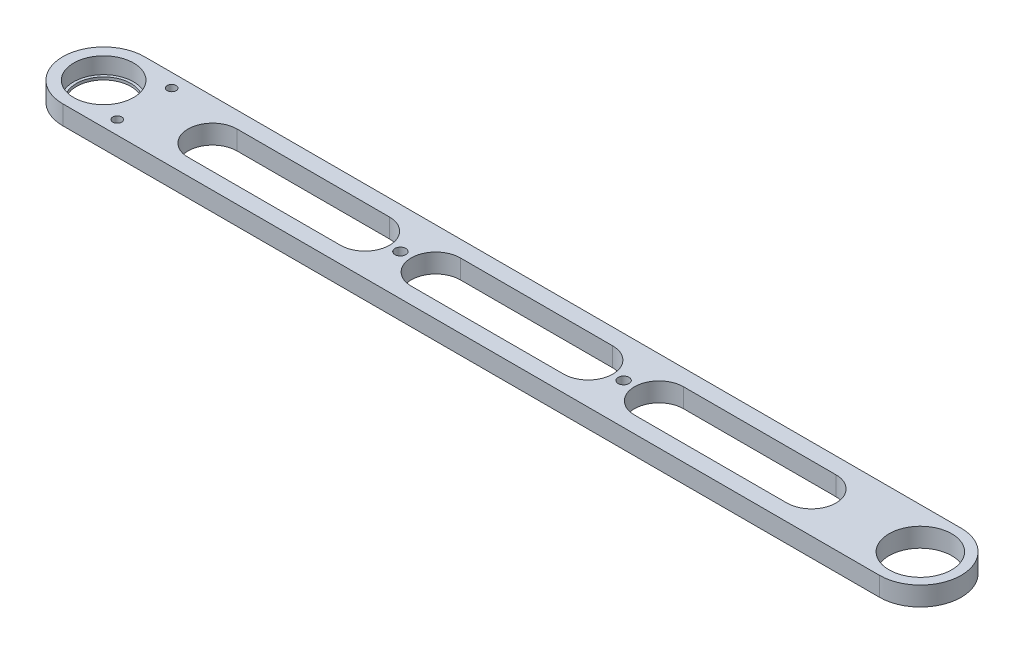
ISO-10303-21;
HEADER;
FILE_DESCRIPTION(('STEP AP214'),'2;1');
FILE_NAME('part.step','',(''),(''),'','','');
FILE_SCHEMA(('AUTOMOTIVE_DESIGN { 1 0 10303 214 1 1 1 1 }'));
ENDSEC;
DATA;
#1=APPLICATION_CONTEXT('core data for automotive mechanical design processes');
#2=APPLICATION_PROTOCOL_DEFINITION('international standard','automotive_design',2000,#1);
#3=PRODUCT_CONTEXT('',#1,'mechanical');
#4=PRODUCT('Part','Part','',(#3));
#5=PRODUCT_RELATED_PRODUCT_CATEGORY('part','',(#4));
#6=PRODUCT_DEFINITION_FORMATION('','',#4);
#7=PRODUCT_DEFINITION_CONTEXT('part definition',#1,'design');
#8=PRODUCT_DEFINITION('design','',#6,#7);
#9=PRODUCT_DEFINITION_SHAPE('','',#8);
#10=(LENGTH_UNIT() NAMED_UNIT(*) SI_UNIT(.MILLI.,.METRE.));
#11=(NAMED_UNIT(*) PLANE_ANGLE_UNIT() SI_UNIT($,.RADIAN.));
#12=(NAMED_UNIT(*) SI_UNIT($,.STERADIAN.) SOLID_ANGLE_UNIT());
#13=UNCERTAINTY_MEASURE_WITH_UNIT(LENGTH_MEASURE(1.E-05),#10,'distance_accuracy_value','');
#14=(GEOMETRIC_REPRESENTATION_CONTEXT(3) GLOBAL_UNCERTAINTY_ASSIGNED_CONTEXT((#13)) GLOBAL_UNIT_ASSIGNED_CONTEXT((#10,
#11,#12)) REPRESENTATION_CONTEXT('',''));
#15=CARTESIAN_POINT('',(0.,0.,0.));
#16=DIRECTION('',(0.,0.,1.));
#17=DIRECTION('',(1.,0.,0.));
#18=AXIS2_PLACEMENT_3D('',#15,#16,#17);
#19=CARTESIAN_POINT('',(-150.,7.,0.));
#20=DIRECTION('',(0.,-1.,0.));
#21=DIRECTION('',(0.,0.,-1.));
#22=AXIS2_PLACEMENT_3D('',#19,#20,#21);
#23=CYLINDRICAL_SURFACE('',#22,10.);
#24=CARTESIAN_POINT('',(-150.,0.,0.));
#25=DIRECTION('',(0.,1.,0.));
#26=DIRECTION('',(0.,0.,1.));
#27=AXIS2_PLACEMENT_3D('',#24,#25,#26);
#28=CIRCLE('',#27,10.);
#29=CARTESIAN_POINT('',(-150.,0.,10.));
#30=VERTEX_POINT('',#29);
#31=EDGE_CURVE('E284',#30,#30,#28,.T.);
#32=ORIENTED_EDGE('',*,*,#31,.F.);
#33=EDGE_LOOP('',(#32));
#34=FACE_BOUND('',#33,.T.);
#35=CARTESIAN_POINT('',(-150.,1.,0.));
#36=DIRECTION('',(0.,1.,0.));
#37=DIRECTION('',(0.,0.,1.));
#38=AXIS2_PLACEMENT_3D('',#35,#36,#37);
#39=CIRCLE('',#38,10.);
#40=CARTESIAN_POINT('',(-150.,1.,10.));
#41=VERTEX_POINT('',#40);
#42=EDGE_CURVE('E42',#41,#41,#39,.T.);
#43=ORIENTED_EDGE('',*,*,#42,.T.);
#44=EDGE_LOOP('',(#43));
#45=FACE_BOUND('',#44,.T.);
#46=ADVANCED_FACE('F38',(#34,#45),#23,.F.);
#47=CARTESIAN_POINT('',(150.,7.,0.));
#48=DIRECTION('',(0.,1.,0.));
#49=DIRECTION('',(0.,0.,1.));
#50=AXIS2_PLACEMENT_3D('',#47,#48,#49);
#51=PLANE('',#50);
#52=CARTESIAN_POINT('',(-135.,7.,-10.));
#53=DIRECTION('',(0.,1.,0.));
#54=DIRECTION('',(0.,0.,1.));
#55=AXIS2_PLACEMENT_3D('',#52,#53,#54);
#56=CIRCLE('',#55,1.64999999999998);
#57=CARTESIAN_POINT('',(-135.,7.,-8.35000000000005));
#58=VERTEX_POINT('',#57);
#59=EDGE_CURVE('E169',#58,#58,#56,.T.);
#60=ORIENTED_EDGE('',*,*,#59,.F.);
#61=EDGE_LOOP('',(#60));
#62=FACE_BOUND('',#61,.T.);
#63=CARTESIAN_POINT('',(-135.,7.,10.));
#64=DIRECTION('',(0.,1.,0.));
#65=DIRECTION('',(0.,0.,1.));
#66=AXIS2_PLACEMENT_3D('',#63,#64,#65);
#67=CIRCLE('',#66,1.64999999999998);
#68=CARTESIAN_POINT('',(-135.,7.,11.65));
#69=VERTEX_POINT('',#68);
#70=EDGE_CURVE('E168',#69,#69,#67,.T.);
#71=ORIENTED_EDGE('',*,*,#70,.F.);
#72=EDGE_LOOP('',(#71));
#73=FACE_BOUND('',#72,.T.);
#74=CARTESIAN_POINT('',(-150.,7.,0.));
#75=DIRECTION('',(0.,1.,0.));
#76=DIRECTION('',(0.,0.,1.));
#77=AXIS2_PLACEMENT_3D('',#74,#75,#76);
#78=CIRCLE('',#77,11.);
#79=CARTESIAN_POINT('',(-150.,7.,11.));
#80=VERTEX_POINT('',#79);
#81=EDGE_CURVE('E179',#80,#80,#78,.T.);
#82=ORIENTED_EDGE('',*,*,#81,.F.);
#83=EDGE_LOOP('',(#82));
#84=FACE_BOUND('',#83,.T.);
#85=CARTESIAN_POINT('',(40.9999999073436,7.,0.));
#86=DIRECTION('',(0.,1.,0.));
#87=DIRECTION('',(0.,0.,1.));
#88=AXIS2_PLACEMENT_3D('',#85,#86,#87);
#89=CIRCLE('',#88,2.);
#90=CARTESIAN_POINT('',(40.9999999073436,7.,2.));
#91=VERTEX_POINT('',#90);
#92=EDGE_CURVE('E192',#91,#91,#89,.T.);
#93=ORIENTED_EDGE('',*,*,#92,.F.);
#94=EDGE_LOOP('',(#93));
#95=FACE_BOUND('',#94,.T.);
#96=CARTESIAN_POINT('',(150.,7.,0.));
#97=DIRECTION('',(0.,1.,0.));
#98=DIRECTION('',(0.,0.,1.));
#99=AXIS2_PLACEMENT_3D('',#96,#97,#98);
#100=CIRCLE('',#99,11.5);
#101=CARTESIAN_POINT('',(150.,7.,11.5));
#102=VERTEX_POINT('',#101);
#103=EDGE_CURVE('E288',#102,#102,#100,.T.);
#104=ORIENTED_EDGE('',*,*,#103,.F.);
#105=EDGE_LOOP('',(#104));
#106=FACE_BOUND('',#105,.T.);
#107=CARTESIAN_POINT('',(150.,7.,0.));
#108=DIRECTION('',(0.,1.,0.));
#109=DIRECTION('',(0.,0.,1.));
#110=AXIS2_PLACEMENT_3D('',#107,#108,#109);
#111=CIRCLE('',#110,15.);
#112=CARTESIAN_POINT('',(150.,7.,15.));
#113=VERTEX_POINT('',#112);
#114=CARTESIAN_POINT('',(150.,7.,-15.0000000000001));
#115=VERTEX_POINT('',#114);
#116=EDGE_CURVE('E294',#113,#115,#111,.T.);
#117=ORIENTED_EDGE('',*,*,#116,.T.);
#118=DIRECTION('',(-1.,0.,0.));
#119=VECTOR('',#118,1.);
#120=CARTESIAN_POINT('',(-150.,7.,-15.));
#121=LINE('',#120,#119);
#122=CARTESIAN_POINT('',(-150.,7.,-15.));
#123=VERTEX_POINT('',#122);
#124=EDGE_CURVE('E297',#115,#123,#121,.T.);
#125=ORIENTED_EDGE('',*,*,#124,.T.);
#126=CARTESIAN_POINT('',(-150.,7.,0.));
#127=DIRECTION('',(0.,1.,0.));
#128=DIRECTION('',(0.,0.,1.));
#129=AXIS2_PLACEMENT_3D('',#126,#127,#128);
#130=CIRCLE('',#129,15.);
#131=CARTESIAN_POINT('',(-150.,7.,15.));
#132=VERTEX_POINT('',#131);
#133=EDGE_CURVE('E300',#123,#132,#130,.T.);
#134=ORIENTED_EDGE('',*,*,#133,.T.);
#135=DIRECTION('',(1.,0.,0.));
#136=VECTOR('',#135,1.);
#137=CARTESIAN_POINT('',(150.,7.,15.));
#138=LINE('',#137,#136);
#139=EDGE_CURVE('E302',#132,#113,#138,.T.);
#140=ORIENTED_EDGE('',*,*,#139,.T.);
#141=EDGE_LOOP('',(#117,#125,#134,#140));
#142=FACE_BOUND('',#141,.T.);
#143=DIRECTION('',(1.,0.,0.));
#144=VECTOR('',#143,1.);
#145=CARTESIAN_POINT('',(-110.,7.,9.));
#146=LINE('',#145,#144);
#147=CARTESIAN_POINT('',(-110.,7.,9.));
#148=VERTEX_POINT('',#147);
#149=CARTESIAN_POINT('',(-53.9999999803265,7.,9.));
#150=VERTEX_POINT('',#149);
#151=EDGE_CURVE('E256',#148,#150,#146,.T.);
#152=ORIENTED_EDGE('',*,*,#151,.F.);
#153=CARTESIAN_POINT('',(-110.,7.,0.));
#154=DIRECTION('',(0.,1.,0.));
#155=DIRECTION('',(0.,0.,-1.));
#156=AXIS2_PLACEMENT_3D('',#153,#154,#155);
#157=CIRCLE('',#156,9.);
#158=CARTESIAN_POINT('',(-110.,7.,-9.));
#159=VERTEX_POINT('',#158);
#160=EDGE_CURVE('E254',#159,#148,#157,.T.);
#161=ORIENTED_EDGE('',*,*,#160,.F.);
#162=DIRECTION('',(-1.,0.,0.));
#163=VECTOR('',#162,1.);
#164=CARTESIAN_POINT('',(-53.9999999803265,7.,-9.));
#165=LINE('',#164,#163);
#166=CARTESIAN_POINT('',(-53.9999999803265,7.,-9.));
#167=VERTEX_POINT('',#166);
#168=EDGE_CURVE('E262',#167,#159,#165,.T.);
#169=ORIENTED_EDGE('',*,*,#168,.F.);
#170=CARTESIAN_POINT('',(-53.9999999803265,7.,0.));
#171=DIRECTION('',(0.,1.,0.));
#172=DIRECTION('',(0.,0.,1.));
#173=AXIS2_PLACEMENT_3D('',#170,#171,#172);
#174=CIRCLE('',#173,9.);
#175=EDGE_CURVE('E259',#150,#167,#174,.T.);
#176=ORIENTED_EDGE('',*,*,#175,.F.);
#177=EDGE_LOOP('',(#152,#161,#169,#176));
#178=FACE_BOUND('',#177,.T.);
#179=DIRECTION('',(1.,0.,0.));
#180=VECTOR('',#179,1.);
#181=CARTESIAN_POINT('',(-28.00000011233,7.,9.));
#182=LINE('',#181,#180);
#183=CARTESIAN_POINT('',(-28.00000011233,7.,9.));
#184=VERTEX_POINT('',#183);
#185=CARTESIAN_POINT('',(27.9999999073436,7.,9.));
#186=VERTEX_POINT('',#185);
#187=EDGE_CURVE('E225',#184,#186,#182,.T.);
#188=ORIENTED_EDGE('',*,*,#187,.F.);
#189=CARTESIAN_POINT('',(-27.9999999803265,7.,0.));
#190=DIRECTION('',(0.,1.,0.));
#191=DIRECTION('',(0.,0.,-1.));
#192=AXIS2_PLACEMENT_3D('',#189,#190,#191);
#193=CIRCLE('',#192,9.);
#194=CARTESIAN_POINT('',(-28.00000011233,7.,-9.));
#195=VERTEX_POINT('',#194);
#196=EDGE_CURVE('E223',#195,#184,#193,.T.);
#197=ORIENTED_EDGE('',*,*,#196,.F.);
#198=DIRECTION('',(-1.,0.,0.));
#199=VECTOR('',#198,1.);
#200=CARTESIAN_POINT('',(27.9999999073436,7.,-9.));
#201=LINE('',#200,#199);
#202=CARTESIAN_POINT('',(27.9999999073436,7.,-9.));
#203=VERTEX_POINT('',#202);
#204=EDGE_CURVE('E231',#203,#195,#201,.T.);
#205=ORIENTED_EDGE('',*,*,#204,.F.);
#206=CARTESIAN_POINT('',(27.9999999073436,7.,0.));
#207=DIRECTION('',(0.,1.,0.));
#208=DIRECTION('',(0.,0.,1.));
#209=AXIS2_PLACEMENT_3D('',#206,#207,#208);
#210=CIRCLE('',#209,9.);
#211=EDGE_CURVE('E228',#186,#203,#210,.T.);
#212=ORIENTED_EDGE('',*,*,#211,.F.);
#213=EDGE_LOOP('',(#188,#197,#205,#212));
#214=FACE_BOUND('',#213,.T.);
#215=DIRECTION('',(1.,0.,0.));
#216=VECTOR('',#215,1.);
#217=CARTESIAN_POINT('',(53.9999999073436,7.,9.));
#218=LINE('',#217,#216);
#219=CARTESIAN_POINT('',(53.9999999073436,7.,9.));
#220=VERTEX_POINT('',#219);
#221=CARTESIAN_POINT('',(109.999999927017,7.,9.));
#222=VERTEX_POINT('',#221);
#223=EDGE_CURVE('E199',#220,#222,#218,.T.);
#224=ORIENTED_EDGE('',*,*,#223,.F.);
#225=CARTESIAN_POINT('',(53.9999999073436,7.,0.));
#226=DIRECTION('',(0.,1.,0.));
#227=DIRECTION('',(0.,0.,-1.));
#228=AXIS2_PLACEMENT_3D('',#225,#226,#227);
#229=CIRCLE('',#228,9.);
#230=CARTESIAN_POINT('',(53.9999999073436,7.,-9.));
#231=VERTEX_POINT('',#230);
#232=EDGE_CURVE('E197',#231,#220,#229,.T.);
#233=ORIENTED_EDGE('',*,*,#232,.F.);
#234=DIRECTION('',(-1.,0.,0.));
#235=VECTOR('',#234,1.);
#236=CARTESIAN_POINT('',(109.999999927017,7.,-9.));
#237=LINE('',#236,#235);
#238=CARTESIAN_POINT('',(109.999999927017,7.,-9.));
#239=VERTEX_POINT('',#238);
#240=EDGE_CURVE('E204',#239,#231,#237,.T.);
#241=ORIENTED_EDGE('',*,*,#240,.F.);
#242=CARTESIAN_POINT('',(110.,7.,0.));
#243=DIRECTION('',(0.,1.,0.));
#244=DIRECTION('',(0.,0.,1.));
#245=AXIS2_PLACEMENT_3D('',#242,#243,#244);
#246=CIRCLE('',#245,9.);
#247=EDGE_CURVE('E202',#222,#239,#246,.T.);
#248=ORIENTED_EDGE('',*,*,#247,.F.);
#249=EDGE_LOOP('',(#224,#233,#241,#248));
#250=FACE_BOUND('',#249,.T.);
#251=CARTESIAN_POINT('',(-40.9999999803265,7.,0.));
#252=DIRECTION('',(0.,1.,0.));
#253=DIRECTION('',(0.,0.,1.));
#254=AXIS2_PLACEMENT_3D('',#251,#252,#253);
#255=CIRCLE('',#254,2.);
#256=CARTESIAN_POINT('',(-40.9999999803265,7.,2.));
#257=VERTEX_POINT('',#256);
#258=EDGE_CURVE('E185',#257,#257,#255,.T.);
#259=ORIENTED_EDGE('',*,*,#258,.F.);
#260=EDGE_LOOP('',(#259));
#261=FACE_BOUND('',#260,.T.);
#262=ADVANCED_FACE('F338',(#62,#73,#84,#95,#106,#142,#178,#214,#250,#261),#51,.T.);
#263=CARTESIAN_POINT('',(150.,0.,0.));
#264=DIRECTION('',(0.,1.,0.));
#265=DIRECTION('',(0.,0.,1.));
#266=AXIS2_PLACEMENT_3D('',#263,#264,#265);
#267=PLANE('',#266);
#268=CARTESIAN_POINT('',(-27.9999999803265,0.,0.));
#269=DIRECTION('',(0.,1.,0.));
#270=DIRECTION('',(0.,0.,-1.));
#271=AXIS2_PLACEMENT_3D('',#268,#269,#270);
#272=CIRCLE('',#271,9.);
#273=CARTESIAN_POINT('',(-28.0000001123299,0.,-9.));
#274=VERTEX_POINT('',#273);
#275=CARTESIAN_POINT('',(-28.00000011233,0.,9.));
#276=VERTEX_POINT('',#275);
#277=EDGE_CURVE('E222',#274,#276,#272,.T.);
#278=ORIENTED_EDGE('',*,*,#277,.T.);
#279=DIRECTION('',(1.,0.,0.));
#280=VECTOR('',#279,1.);
#281=CARTESIAN_POINT('',(-28.00000011233,0.,9.));
#282=LINE('',#281,#280);
#283=CARTESIAN_POINT('',(27.9999999073436,0.,9.));
#284=VERTEX_POINT('',#283);
#285=EDGE_CURVE('E236',#276,#284,#282,.T.);
#286=ORIENTED_EDGE('',*,*,#285,.T.);
#287=CARTESIAN_POINT('',(27.9999999073436,0.,0.));
#288=DIRECTION('',(0.,1.,0.));
#289=DIRECTION('',(0.,0.,1.));
#290=AXIS2_PLACEMENT_3D('',#287,#288,#289);
#291=CIRCLE('',#290,9.);
#292=CARTESIAN_POINT('',(27.9999999073436,0.,-9.));
#293=VERTEX_POINT('',#292);
#294=EDGE_CURVE('E239',#284,#293,#291,.T.);
#295=ORIENTED_EDGE('',*,*,#294,.T.);
#296=DIRECTION('',(-1.,0.,0.));
#297=VECTOR('',#296,1.);
#298=CARTESIAN_POINT('',(27.9999999073436,0.,-9.));
#299=LINE('',#298,#297);
#300=EDGE_CURVE('E226',#293,#274,#299,.T.);
#301=ORIENTED_EDGE('',*,*,#300,.T.);
#302=EDGE_LOOP('',(#278,#286,#295,#301));
#303=FACE_BOUND('',#302,.T.);
#304=ORIENTED_EDGE('',*,*,#31,.T.);
#305=EDGE_LOOP('',(#304));
#306=FACE_BOUND('',#305,.T.);
#307=CARTESIAN_POINT('',(150.,0.,0.));
#308=DIRECTION('',(0.,1.,0.));
#309=DIRECTION('',(0.,0.,1.));
#310=AXIS2_PLACEMENT_3D('',#307,#308,#309);
#311=CIRCLE('',#310,11.5);
#312=CARTESIAN_POINT('',(150.,0.,11.5));
#313=VERTEX_POINT('',#312);
#314=EDGE_CURVE('E287',#313,#313,#311,.T.);
#315=ORIENTED_EDGE('',*,*,#314,.T.);
#316=EDGE_LOOP('',(#315));
#317=FACE_BOUND('',#316,.T.);
#318=CARTESIAN_POINT('',(150.,0.,0.));
#319=DIRECTION('',(0.,1.,0.));
#320=DIRECTION('',(0.,0.,1.));
#321=AXIS2_PLACEMENT_3D('',#318,#319,#320);
#322=CIRCLE('',#321,15.);
#323=CARTESIAN_POINT('',(150.,0.,15.));
#324=VERTEX_POINT('',#323);
#325=CARTESIAN_POINT('',(150.,0.,-15.0000000000001));
#326=VERTEX_POINT('',#325);
#327=EDGE_CURVE('E291',#324,#326,#322,.T.);
#328=ORIENTED_EDGE('',*,*,#327,.F.);
#329=DIRECTION('',(1.,0.,0.));
#330=VECTOR('',#329,1.);
#331=CARTESIAN_POINT('',(150.,0.,15.));
#332=LINE('',#331,#330);
#333=CARTESIAN_POINT('',(-150.,0.,15.));
#334=VERTEX_POINT('',#333);
#335=EDGE_CURVE('E298',#334,#324,#332,.T.);
#336=ORIENTED_EDGE('',*,*,#335,.F.);
#337=CARTESIAN_POINT('',(-150.,0.,0.));
#338=DIRECTION('',(0.,1.,0.));
#339=DIRECTION('',(0.,0.,1.));
#340=AXIS2_PLACEMENT_3D('',#337,#338,#339);
#341=CIRCLE('',#340,15.);
#342=CARTESIAN_POINT('',(-150.,0.,-15.));
#343=VERTEX_POINT('',#342);
#344=EDGE_CURVE('E309',#343,#334,#341,.T.);
#345=ORIENTED_EDGE('',*,*,#344,.F.);
#346=DIRECTION('',(-1.,0.,0.));
#347=VECTOR('',#346,1.);
#348=CARTESIAN_POINT('',(-150.,0.,-15.));
#349=LINE('',#348,#347);
#350=EDGE_CURVE('E307',#326,#343,#349,.T.);
#351=ORIENTED_EDGE('',*,*,#350,.F.);
#352=EDGE_LOOP('',(#328,#336,#345,#351));
#353=FACE_BOUND('',#352,.T.);
#354=CARTESIAN_POINT('',(-110.,0.,0.));
#355=DIRECTION('',(0.,1.,0.));
#356=DIRECTION('',(0.,0.,-1.));
#357=AXIS2_PLACEMENT_3D('',#354,#355,#356);
#358=CIRCLE('',#357,9.);
#359=CARTESIAN_POINT('',(-110.,0.,-9.));
#360=VERTEX_POINT('',#359);
#361=CARTESIAN_POINT('',(-110.,0.,9.));
#362=VERTEX_POINT('',#361);
#363=EDGE_CURVE('E253',#360,#362,#358,.T.);
#364=ORIENTED_EDGE('',*,*,#363,.T.);
#365=DIRECTION('',(1.,0.,0.));
#366=VECTOR('',#365,1.);
#367=CARTESIAN_POINT('',(-110.,0.,9.));
#368=LINE('',#367,#366);
#369=CARTESIAN_POINT('',(-53.9999999803265,0.,9.));
#370=VERTEX_POINT('',#369);
#371=EDGE_CURVE('E267',#362,#370,#368,.T.);
#372=ORIENTED_EDGE('',*,*,#371,.T.);
#373=CARTESIAN_POINT('',(-53.9999999803265,0.,0.));
#374=DIRECTION('',(0.,1.,0.));
#375=DIRECTION('',(0.,0.,1.));
#376=AXIS2_PLACEMENT_3D('',#373,#374,#375);
#377=CIRCLE('',#376,9.);
#378=CARTESIAN_POINT('',(-53.9999999803265,0.,-9.));
#379=VERTEX_POINT('',#378);
#380=EDGE_CURVE('E270',#370,#379,#377,.T.);
#381=ORIENTED_EDGE('',*,*,#380,.T.);
#382=DIRECTION('',(-1.,0.,0.));
#383=VECTOR('',#382,1.);
#384=CARTESIAN_POINT('',(-53.9999999803265,0.,-9.));
#385=LINE('',#384,#383);
#386=EDGE_CURVE('E257',#379,#360,#385,.T.);
#387=ORIENTED_EDGE('',*,*,#386,.T.);
#388=EDGE_LOOP('',(#364,#372,#381,#387));
#389=FACE_BOUND('',#388,.T.);
#390=CARTESIAN_POINT('',(53.9999999073436,0.,0.));
#391=DIRECTION('',(0.,1.,0.));
#392=DIRECTION('',(0.,0.,-1.));
#393=AXIS2_PLACEMENT_3D('',#390,#391,#392);
#394=CIRCLE('',#393,9.);
#395=CARTESIAN_POINT('',(53.9999999073436,0.,-9.));
#396=VERTEX_POINT('',#395);
#397=CARTESIAN_POINT('',(53.9999999073436,0.,9.));
#398=VERTEX_POINT('',#397);
#399=EDGE_CURVE('E62',#396,#398,#394,.T.);
#400=ORIENTED_EDGE('',*,*,#399,.T.);
#401=DIRECTION('',(1.,0.,0.));
#402=VECTOR('',#401,1.);
#403=CARTESIAN_POINT('',(53.9999999073436,0.,9.));
#404=LINE('',#403,#402);
#405=CARTESIAN_POINT('',(109.999999927017,0.,9.));
#406=VERTEX_POINT('',#405);
#407=EDGE_CURVE('E208',#398,#406,#404,.T.);
#408=ORIENTED_EDGE('',*,*,#407,.T.);
#409=CARTESIAN_POINT('',(110.,0.,0.));
#410=DIRECTION('',(0.,1.,0.));
#411=DIRECTION('',(0.,0.,1.));
#412=AXIS2_PLACEMENT_3D('',#409,#410,#411);
#413=CIRCLE('',#412,9.);
#414=CARTESIAN_POINT('',(109.999999927017,0.,-9.));
#415=VERTEX_POINT('',#414);
#416=EDGE_CURVE('E211',#406,#415,#413,.T.);
#417=ORIENTED_EDGE('',*,*,#416,.T.);
#418=DIRECTION('',(-1.,0.,0.));
#419=VECTOR('',#418,1.);
#420=CARTESIAN_POINT('',(109.999999927017,0.,-9.));
#421=LINE('',#420,#419);
#422=EDGE_CURVE('E200',#415,#396,#421,.T.);
#423=ORIENTED_EDGE('',*,*,#422,.T.);
#424=EDGE_LOOP('',(#400,#408,#417,#423));
#425=FACE_BOUND('',#424,.T.);
#426=CARTESIAN_POINT('',(40.9999999073436,0.,0.));
#427=DIRECTION('',(0.,1.,0.));
#428=DIRECTION('',(0.,0.,1.));
#429=AXIS2_PLACEMENT_3D('',#426,#427,#428);
#430=CIRCLE('',#429,2.);
#431=CARTESIAN_POINT('',(40.9999999073436,0.,2.));
#432=VERTEX_POINT('',#431);
#433=EDGE_CURVE('E188',#432,#432,#430,.T.);
#434=ORIENTED_EDGE('',*,*,#433,.T.);
#435=EDGE_LOOP('',(#434));
#436=FACE_BOUND('',#435,.T.);
#437=CARTESIAN_POINT('',(-40.9999999803265,0.,0.));
#438=DIRECTION('',(0.,1.,0.));
#439=DIRECTION('',(0.,0.,1.));
#440=AXIS2_PLACEMENT_3D('',#437,#438,#439);
#441=CIRCLE('',#440,2.);
#442=CARTESIAN_POINT('',(-40.9999999803265,0.,2.));
#443=VERTEX_POINT('',#442);
#444=EDGE_CURVE('E189',#443,#443,#441,.T.);
#445=ORIENTED_EDGE('',*,*,#444,.T.);
#446=EDGE_LOOP('',(#445));
#447=FACE_BOUND('',#446,.T.);
#448=ADVANCED_FACE('F328',(#303,#306,#317,#353,#389,#425,#436,#447),#267,.F.);
#449=CARTESIAN_POINT('',(150.,7.,0.));
#450=DIRECTION('',(0.,-1.,0.));
#451=DIRECTION('',(0.,0.,-1.));
#452=AXIS2_PLACEMENT_3D('',#449,#450,#451);
#453=CYLINDRICAL_SURFACE('',#452,15.);
#454=ORIENTED_EDGE('',*,*,#327,.T.);
#455=DIRECTION('',(0.,-1.,0.));
#456=VECTOR('',#455,1.);
#457=CARTESIAN_POINT('',(150.,7.,-15.0000000000001));
#458=LINE('',#457,#456);
#459=EDGE_CURVE('E11',#115,#326,#458,.T.);
#460=ORIENTED_EDGE('',*,*,#459,.F.);
#461=ORIENTED_EDGE('',*,*,#116,.F.);
#462=DIRECTION('',(0.,-1.,0.));
#463=VECTOR('',#462,1.);
#464=CARTESIAN_POINT('',(150.,7.,15.));
#465=LINE('',#464,#463);
#466=EDGE_CURVE('E304',#113,#324,#465,.T.);
#467=ORIENTED_EDGE('',*,*,#466,.T.);
#468=EDGE_LOOP('',(#454,#460,#461,#467));
#469=FACE_BOUND('',#468,.T.);
#470=ADVANCED_FACE('F40',(#469),#453,.T.);
#471=CARTESIAN_POINT('',(-150.,7.,-15.));
#472=DIRECTION('',(0.,0.,1.));
#473=DIRECTION('',(1.,0.,0.));
#474=AXIS2_PLACEMENT_3D('',#471,#472,#473);
#475=PLANE('',#474);
#476=ORIENTED_EDGE('',*,*,#350,.T.);
#477=DIRECTION('',(0.,-1.,0.));
#478=VECTOR('',#477,1.);
#479=CARTESIAN_POINT('',(-150.,7.,-15.));
#480=LINE('',#479,#478);
#481=EDGE_CURVE('E47',#123,#343,#480,.T.);
#482=ORIENTED_EDGE('',*,*,#481,.F.);
#483=ORIENTED_EDGE('',*,*,#124,.F.);
#484=ORIENTED_EDGE('',*,*,#459,.T.);
#485=EDGE_LOOP('',(#476,#482,#483,#484));
#486=FACE_BOUND('',#485,.T.);
#487=ADVANCED_FACE('F340',(#486),#475,.F.);
#488=CARTESIAN_POINT('',(-150.,7.,0.));
#489=DIRECTION('',(0.,-1.,0.));
#490=DIRECTION('',(0.,0.,-1.));
#491=AXIS2_PLACEMENT_3D('',#488,#489,#490);
#492=CYLINDRICAL_SURFACE('',#491,15.);
#493=ORIENTED_EDGE('',*,*,#344,.T.);
#494=DIRECTION('',(0.,-1.,0.));
#495=VECTOR('',#494,1.);
#496=CARTESIAN_POINT('',(-150.,7.,15.));
#497=LINE('',#496,#495);
#498=EDGE_CURVE('E314',#132,#334,#497,.T.);
#499=ORIENTED_EDGE('',*,*,#498,.F.);
#500=ORIENTED_EDGE('',*,*,#133,.F.);
#501=ORIENTED_EDGE('',*,*,#481,.T.);
#502=EDGE_LOOP('',(#493,#499,#500,#501));
#503=FACE_BOUND('',#502,.T.);
#504=ADVANCED_FACE('F322',(#503),#492,.T.);
#505=CARTESIAN_POINT('',(150.,7.,15.));
#506=DIRECTION('',(0.,0.,-1.));
#507=DIRECTION('',(-1.,0.,0.));
#508=AXIS2_PLACEMENT_3D('',#505,#506,#507);
#509=PLANE('',#508);
#510=ORIENTED_EDGE('',*,*,#335,.T.);
#511=ORIENTED_EDGE('',*,*,#466,.F.);
#512=ORIENTED_EDGE('',*,*,#139,.F.);
#513=ORIENTED_EDGE('',*,*,#498,.T.);
#514=EDGE_LOOP('',(#510,#511,#512,#513));
#515=FACE_BOUND('',#514,.T.);
#516=ADVANCED_FACE('F332',(#515),#509,.F.);
#517=CARTESIAN_POINT('',(150.,7.,0.));
#518=DIRECTION('',(0.,-1.,0.));
#519=DIRECTION('',(0.,0.,-1.));
#520=AXIS2_PLACEMENT_3D('',#517,#518,#519);
#521=CYLINDRICAL_SURFACE('',#520,11.5);
#522=ORIENTED_EDGE('',*,*,#103,.T.);
#523=EDGE_LOOP('',(#522));
#524=FACE_BOUND('',#523,.T.);
#525=ORIENTED_EDGE('',*,*,#314,.F.);
#526=EDGE_LOOP('',(#525));
#527=FACE_BOUND('',#526,.T.);
#528=ADVANCED_FACE('F361',(#524,#527),#521,.F.);
#529=CARTESIAN_POINT('',(-110.,7.,0.));
#530=DIRECTION('',(0.,-1.,0.));
#531=DIRECTION('',(0.,0.,-1.));
#532=AXIS2_PLACEMENT_3D('',#529,#530,#531);
#533=CYLINDRICAL_SURFACE('',#532,9.);
#534=ORIENTED_EDGE('',*,*,#363,.F.);
#535=DIRECTION('',(0.,-1.,0.));
#536=VECTOR('',#535,1.);
#537=CARTESIAN_POINT('',(-110.,7.,-9.));
#538=LINE('',#537,#536);
#539=EDGE_CURVE('E264',#159,#360,#538,.T.);
#540=ORIENTED_EDGE('',*,*,#539,.F.);
#541=ORIENTED_EDGE('',*,*,#160,.T.);
#542=DIRECTION('',(0.,-1.,0.));
#543=VECTOR('',#542,1.);
#544=CARTESIAN_POINT('',(-110.,7.,9.));
#545=LINE('',#544,#543);
#546=EDGE_CURVE('E281',#148,#362,#545,.T.);
#547=ORIENTED_EDGE('',*,*,#546,.T.);
#548=EDGE_LOOP('',(#534,#540,#541,#547));
#549=FACE_BOUND('',#548,.T.);
#550=ADVANCED_FACE('F359',(#549),#533,.F.);
#551=CARTESIAN_POINT('',(-110.,7.,9.));
#552=DIRECTION('',(0.,0.,-1.));
#553=DIRECTION('',(-1.,0.,0.));
#554=AXIS2_PLACEMENT_3D('',#551,#552,#553);
#555=PLANE('',#554);
#556=ORIENTED_EDGE('',*,*,#371,.F.);
#557=ORIENTED_EDGE('',*,*,#546,.F.);
#558=ORIENTED_EDGE('',*,*,#151,.T.);
#559=DIRECTION('',(0.,-1.,0.));
#560=VECTOR('',#559,1.);
#561=CARTESIAN_POINT('',(-53.9999999803265,7.,9.));
#562=LINE('',#561,#560);
#563=EDGE_CURVE('E279',#150,#370,#562,.T.);
#564=ORIENTED_EDGE('',*,*,#563,.T.);
#565=EDGE_LOOP('',(#556,#557,#558,#564));
#566=FACE_BOUND('',#565,.T.);
#567=ADVANCED_FACE('F383',(#566),#555,.T.);
#568=CARTESIAN_POINT('',(-53.9999999803265,7.,0.));
#569=DIRECTION('',(0.,-1.,0.));
#570=DIRECTION('',(0.,0.,-1.));
#571=AXIS2_PLACEMENT_3D('',#568,#569,#570);
#572=CYLINDRICAL_SURFACE('',#571,9.);
#573=ORIENTED_EDGE('',*,*,#380,.F.);
#574=ORIENTED_EDGE('',*,*,#563,.F.);
#575=ORIENTED_EDGE('',*,*,#175,.T.);
#576=DIRECTION('',(0.,-1.,0.));
#577=VECTOR('',#576,1.);
#578=CARTESIAN_POINT('',(-53.9999999803265,7.,-9.));
#579=LINE('',#578,#577);
#580=EDGE_CURVE('E277',#167,#379,#579,.T.);
#581=ORIENTED_EDGE('',*,*,#580,.T.);
#582=EDGE_LOOP('',(#573,#574,#575,#581));
#583=FACE_BOUND('',#582,.T.);
#584=ADVANCED_FACE('F390',(#583),#572,.F.);
#585=CARTESIAN_POINT('',(-53.9999999803265,7.,-9.));
#586=DIRECTION('',(0.,0.,1.));
#587=DIRECTION('',(1.,0.,0.));
#588=AXIS2_PLACEMENT_3D('',#585,#586,#587);
#589=PLANE('',#588);
#590=ORIENTED_EDGE('',*,*,#386,.F.);
#591=ORIENTED_EDGE('',*,*,#580,.F.);
#592=ORIENTED_EDGE('',*,*,#168,.T.);
#593=ORIENTED_EDGE('',*,*,#539,.T.);
#594=EDGE_LOOP('',(#590,#591,#592,#593));
#595=FACE_BOUND('',#594,.T.);
#596=ADVANCED_FACE('F397',(#595),#589,.T.);
#597=CARTESIAN_POINT('',(-27.9999999803265,7.,0.));
#598=DIRECTION('',(0.,-1.,0.));
#599=DIRECTION('',(0.,0.,-1.));
#600=AXIS2_PLACEMENT_3D('',#597,#598,#599);
#601=CYLINDRICAL_SURFACE('',#600,9.);
#602=ORIENTED_EDGE('',*,*,#277,.F.);
#603=DIRECTION('',(0.,-1.,0.));
#604=VECTOR('',#603,1.);
#605=CARTESIAN_POINT('',(-28.00000011233,7.,-9.));
#606=LINE('',#605,#604);
#607=EDGE_CURVE('E233',#195,#274,#606,.T.);
#608=ORIENTED_EDGE('',*,*,#607,.F.);
#609=ORIENTED_EDGE('',*,*,#196,.T.);
#610=DIRECTION('',(0.,-1.,0.));
#611=VECTOR('',#610,1.);
#612=CARTESIAN_POINT('',(-28.00000011233,7.,9.));
#613=LINE('',#612,#611);
#614=EDGE_CURVE('E250',#184,#276,#613,.T.);
#615=ORIENTED_EDGE('',*,*,#614,.T.);
#616=EDGE_LOOP('',(#602,#608,#609,#615));
#617=FACE_BOUND('',#616,.T.);
#618=ADVANCED_FACE('F405',(#617),#601,.F.);
#619=CARTESIAN_POINT('',(-28.00000011233,7.,9.));
#620=DIRECTION('',(0.,0.,-1.));
#621=DIRECTION('',(-1.,0.,0.));
#622=AXIS2_PLACEMENT_3D('',#619,#620,#621);
#623=PLANE('',#622);
#624=ORIENTED_EDGE('',*,*,#285,.F.);
#625=ORIENTED_EDGE('',*,*,#614,.F.);
#626=ORIENTED_EDGE('',*,*,#187,.T.);
#627=DIRECTION('',(0.,-1.,0.));
#628=VECTOR('',#627,1.);
#629=CARTESIAN_POINT('',(27.9999999073436,7.,9.));
#630=LINE('',#629,#628);
#631=EDGE_CURVE('E248',#186,#284,#630,.T.);
#632=ORIENTED_EDGE('',*,*,#631,.T.);
#633=EDGE_LOOP('',(#624,#625,#626,#632));
#634=FACE_BOUND('',#633,.T.);
#635=ADVANCED_FACE('F413',(#634),#623,.T.);
#636=CARTESIAN_POINT('',(27.9999999073436,7.,0.));
#637=DIRECTION('',(0.,-1.,0.));
#638=DIRECTION('',(0.,0.,-1.));
#639=AXIS2_PLACEMENT_3D('',#636,#637,#638);
#640=CYLINDRICAL_SURFACE('',#639,9.);
#641=ORIENTED_EDGE('',*,*,#294,.F.);
#642=ORIENTED_EDGE('',*,*,#631,.F.);
#643=ORIENTED_EDGE('',*,*,#211,.T.);
#644=DIRECTION('',(0.,-1.,0.));
#645=VECTOR('',#644,1.);
#646=CARTESIAN_POINT('',(27.9999999073436,7.,-9.));
#647=LINE('',#646,#645);
#648=EDGE_CURVE('E246',#203,#293,#647,.T.);
#649=ORIENTED_EDGE('',*,*,#648,.T.);
#650=EDGE_LOOP('',(#641,#642,#643,#649));
#651=FACE_BOUND('',#650,.T.);
#652=ADVANCED_FACE('F421',(#651),#640,.F.);
#653=CARTESIAN_POINT('',(27.9999999073436,7.,-9.));
#654=DIRECTION('',(0.,0.,1.));
#655=DIRECTION('',(1.,0.,0.));
#656=AXIS2_PLACEMENT_3D('',#653,#654,#655);
#657=PLANE('',#656);
#658=ORIENTED_EDGE('',*,*,#300,.F.);
#659=ORIENTED_EDGE('',*,*,#648,.F.);
#660=ORIENTED_EDGE('',*,*,#204,.T.);
#661=ORIENTED_EDGE('',*,*,#607,.T.);
#662=EDGE_LOOP('',(#658,#659,#660,#661));
#663=FACE_BOUND('',#662,.T.);
#664=ADVANCED_FACE('F429',(#663),#657,.T.);
#665=CARTESIAN_POINT('',(53.9999999073436,7.,0.));
#666=DIRECTION('',(0.,-1.,0.));
#667=DIRECTION('',(0.,0.,-1.));
#668=AXIS2_PLACEMENT_3D('',#665,#666,#667);
#669=CYLINDRICAL_SURFACE('',#668,9.);
#670=ORIENTED_EDGE('',*,*,#399,.F.);
#671=DIRECTION('',(0.,-1.,0.));
#672=VECTOR('',#671,1.);
#673=CARTESIAN_POINT('',(53.9999999073436,7.,-9.));
#674=LINE('',#673,#672);
#675=EDGE_CURVE('E206',#231,#396,#674,.T.);
#676=ORIENTED_EDGE('',*,*,#675,.F.);
#677=ORIENTED_EDGE('',*,*,#232,.T.);
#678=DIRECTION('',(0.,-1.,0.));
#679=VECTOR('',#678,1.);
#680=CARTESIAN_POINT('',(53.9999999073436,7.,9.));
#681=LINE('',#680,#679);
#682=EDGE_CURVE('E220',#220,#398,#681,.T.);
#683=ORIENTED_EDGE('',*,*,#682,.T.);
#684=EDGE_LOOP('',(#670,#676,#677,#683));
#685=FACE_BOUND('',#684,.T.);
#686=ADVANCED_FACE('F437',(#685),#669,.F.);
#687=CARTESIAN_POINT('',(53.9999999073436,7.,9.));
#688=DIRECTION('',(0.,0.,-1.));
#689=DIRECTION('',(-1.,0.,0.));
#690=AXIS2_PLACEMENT_3D('',#687,#688,#689);
#691=PLANE('',#690);
#692=ORIENTED_EDGE('',*,*,#407,.F.);
#693=ORIENTED_EDGE('',*,*,#682,.F.);
#694=ORIENTED_EDGE('',*,*,#223,.T.);
#695=DIRECTION('',(0.,-1.,0.));
#696=VECTOR('',#695,1.);
#697=CARTESIAN_POINT('',(109.999999927017,7.,9.));
#698=LINE('',#697,#696);
#699=EDGE_CURVE('E218',#222,#406,#698,.T.);
#700=ORIENTED_EDGE('',*,*,#699,.T.);
#701=EDGE_LOOP('',(#692,#693,#694,#700));
#702=FACE_BOUND('',#701,.T.);
#703=ADVANCED_FACE('F445',(#702),#691,.T.);
#704=CARTESIAN_POINT('',(110.,7.,0.));
#705=DIRECTION('',(0.,-1.,0.));
#706=DIRECTION('',(0.,0.,-1.));
#707=AXIS2_PLACEMENT_3D('',#704,#705,#706);
#708=CYLINDRICAL_SURFACE('',#707,9.);
#709=ORIENTED_EDGE('',*,*,#416,.F.);
#710=ORIENTED_EDGE('',*,*,#699,.F.);
#711=ORIENTED_EDGE('',*,*,#247,.T.);
#712=DIRECTION('',(0.,-1.,0.));
#713=VECTOR('',#712,1.);
#714=CARTESIAN_POINT('',(109.999999927017,7.,-9.));
#715=LINE('',#714,#713);
#716=EDGE_CURVE('E54',#239,#415,#715,.T.);
#717=ORIENTED_EDGE('',*,*,#716,.T.);
#718=EDGE_LOOP('',(#709,#710,#711,#717));
#719=FACE_BOUND('',#718,.T.);
#720=ADVANCED_FACE('F452',(#719),#708,.F.);
#721=CARTESIAN_POINT('',(109.999999927017,7.,-9.));
#722=DIRECTION('',(0.,0.,1.));
#723=DIRECTION('',(1.,0.,0.));
#724=AXIS2_PLACEMENT_3D('',#721,#722,#723);
#725=PLANE('',#724);
#726=ORIENTED_EDGE('',*,*,#422,.F.);
#727=ORIENTED_EDGE('',*,*,#716,.F.);
#728=ORIENTED_EDGE('',*,*,#240,.T.);
#729=ORIENTED_EDGE('',*,*,#675,.T.);
#730=EDGE_LOOP('',(#726,#727,#728,#729));
#731=FACE_BOUND('',#730,.T.);
#732=ADVANCED_FACE('F460',(#731),#725,.T.);
#733=CARTESIAN_POINT('',(40.9999999073436,7.,0.));
#734=DIRECTION('',(0.,-1.,0.));
#735=DIRECTION('',(0.,0.,-1.));
#736=AXIS2_PLACEMENT_3D('',#733,#734,#735);
#737=CYLINDRICAL_SURFACE('',#736,2.);
#738=ORIENTED_EDGE('',*,*,#92,.T.);
#739=EDGE_LOOP('',(#738));
#740=FACE_BOUND('',#739,.T.);
#741=ORIENTED_EDGE('',*,*,#433,.F.);
#742=EDGE_LOOP('',(#741));
#743=FACE_BOUND('',#742,.T.);
#744=ADVANCED_FACE('F468',(#740,#743),#737,.F.);
#745=CARTESIAN_POINT('',(-40.9999999803265,7.,0.));
#746=DIRECTION('',(0.,-1.,0.));
#747=DIRECTION('',(0.,0.,-1.));
#748=AXIS2_PLACEMENT_3D('',#745,#746,#747);
#749=CYLINDRICAL_SURFACE('',#748,2.);
#750=ORIENTED_EDGE('',*,*,#258,.T.);
#751=EDGE_LOOP('',(#750));
#752=FACE_BOUND('',#751,.T.);
#753=ORIENTED_EDGE('',*,*,#444,.F.);
#754=EDGE_LOOP('',(#753));
#755=FACE_BOUND('',#754,.T.);
#756=ADVANCED_FACE('F475',(#752,#755),#749,.F.);
#757=CARTESIAN_POINT('',(-150.,1.,0.));
#758=DIRECTION('',(0.,1.,0.));
#759=DIRECTION('',(0.,0.,1.));
#760=AXIS2_PLACEMENT_3D('',#757,#758,#759);
#761=CYLINDRICAL_SURFACE('',#760,11.);
#762=CARTESIAN_POINT('',(-150.,1.,0.));
#763=DIRECTION('',(0.,1.,0.));
#764=DIRECTION('',(0.,0.,1.));
#765=AXIS2_PLACEMENT_3D('',#762,#763,#764);
#766=CIRCLE('',#765,11.);
#767=CARTESIAN_POINT('',(-150.,1.,11.));
#768=VERTEX_POINT('',#767);
#769=EDGE_CURVE('E180',#768,#768,#766,.T.);
#770=ORIENTED_EDGE('',*,*,#769,.F.);
#771=EDGE_LOOP('',(#770));
#772=FACE_BOUND('',#771,.T.);
#773=ORIENTED_EDGE('',*,*,#81,.T.);
#774=EDGE_LOOP('',(#773));
#775=FACE_BOUND('',#774,.T.);
#776=ADVANCED_FACE('F483',(#772,#775),#761,.F.);
#777=CARTESIAN_POINT('',(-150.,1.,0.));
#778=DIRECTION('',(0.,1.,0.));
#779=DIRECTION('',(0.,0.,1.));
#780=AXIS2_PLACEMENT_3D('',#777,#778,#779);
#781=PLANE('',#780);
#782=ORIENTED_EDGE('',*,*,#42,.F.);
#783=EDGE_LOOP('',(#782));
#784=FACE_BOUND('',#783,.T.);
#785=ORIENTED_EDGE('',*,*,#769,.T.);
#786=EDGE_LOOP('',(#785));
#787=FACE_BOUND('',#786,.T.);
#788=ADVANCED_FACE('F491',(#784,#787),#781,.T.);
#789=CARTESIAN_POINT('',(-135.,2.,10.));
#790=DIRECTION('',(0.,1.,0.));
#791=DIRECTION('',(0.,0.,1.));
#792=AXIS2_PLACEMENT_3D('',#789,#790,#791);
#793=CONICAL_SURFACE('',#792,1.64999999999998,1.02974425867665);
#794=CARTESIAN_POINT('',(-135.,1.00857997860453,10.));
#795=VERTEX_POINT('',#794);
#796=VERTEX_LOOP('',#795);
#797=FACE_BOUND('',#796,.T.);
#798=CARTESIAN_POINT('',(-135.,2.,10.));
#799=DIRECTION('',(0.,1.,0.));
#800=DIRECTION('',(0.,0.,1.));
#801=AXIS2_PLACEMENT_3D('',#798,#799,#800);
#802=CIRCLE('',#801,1.64999999999998);
#803=CARTESIAN_POINT('',(-135.,2.,11.65));
#804=VERTEX_POINT('',#803);
#805=EDGE_CURVE('E172',#804,#804,#802,.T.);
#806=ORIENTED_EDGE('',*,*,#805,.T.);
#807=EDGE_LOOP('',(#806));
#808=FACE_BOUND('',#807,.T.);
#809=ADVANCED_FACE('F499',(#797,#808),#793,.F.);
#810=CARTESIAN_POINT('',(-135.,7.,10.));
#811=DIRECTION('',(0.,1.,0.));
#812=DIRECTION('',(0.,0.,1.));
#813=AXIS2_PLACEMENT_3D('',#810,#811,#812);
#814=CYLINDRICAL_SURFACE('',#813,1.64999999999998);
#815=ORIENTED_EDGE('',*,*,#805,.F.);
#816=EDGE_LOOP('',(#815));
#817=FACE_BOUND('',#816,.T.);
#818=ORIENTED_EDGE('',*,*,#70,.T.);
#819=EDGE_LOOP('',(#818));
#820=FACE_BOUND('',#819,.T.);
#821=ADVANCED_FACE('F162',(#817,#820),#814,.F.);
#822=CARTESIAN_POINT('',(-135.,2.,-10.));
#823=DIRECTION('',(0.,1.,0.));
#824=DIRECTION('',(0.,0.,1.));
#825=AXIS2_PLACEMENT_3D('',#822,#823,#824);
#826=CONICAL_SURFACE('',#825,1.64999999999998,1.02974425867665);
#827=CARTESIAN_POINT('',(-135.,1.00857997860453,-10.));
#828=VERTEX_POINT('',#827);
#829=VERTEX_LOOP('',#828);
#830=FACE_BOUND('',#829,.T.);
#831=CARTESIAN_POINT('',(-135.,2.,-10.));
#832=DIRECTION('',(0.,1.,0.));
#833=DIRECTION('',(0.,0.,1.));
#834=AXIS2_PLACEMENT_3D('',#831,#832,#833);
#835=CIRCLE('',#834,1.64999999999998);
#836=CARTESIAN_POINT('',(-135.,2.,-8.35000000000005));
#837=VERTEX_POINT('',#836);
#838=EDGE_CURVE('E166',#837,#837,#835,.T.);
#839=ORIENTED_EDGE('',*,*,#838,.T.);
#840=EDGE_LOOP('',(#839));
#841=FACE_BOUND('',#840,.T.);
#842=ADVANCED_FACE('F158',(#830,#841),#826,.F.);
#843=CARTESIAN_POINT('',(-135.,7.,-10.));
#844=DIRECTION('',(0.,1.,0.));
#845=DIRECTION('',(0.,0.,1.));
#846=AXIS2_PLACEMENT_3D('',#843,#844,#845);
#847=CYLINDRICAL_SURFACE('',#846,1.64999999999998);
#848=ORIENTED_EDGE('',*,*,#838,.F.);
#849=EDGE_LOOP('',(#848));
#850=FACE_BOUND('',#849,.T.);
#851=ORIENTED_EDGE('',*,*,#59,.T.);
#852=EDGE_LOOP('',(#851));
#853=FACE_BOUND('',#852,.T.);
#854=ADVANCED_FACE('F161',(#850,#853),#847,.F.);
#855=CLOSED_SHELL('',(#46,#262,#448,#470,#487,#504,#516,#528,#550,#567,#584,#596,#618,#635,#652,
#664,#686,#703,#720,#732,#744,#756,#776,#788,#809,#821,#842,#854));
#856=MANIFOLD_SOLID_BREP('B2',#855);
#857=ADVANCED_BREP_SHAPE_REPRESENTATION('',(#18,#856),#14);
#858=SHAPE_DEFINITION_REPRESENTATION(#9,#857);
ENDSEC;
END-ISO-10303-21;
